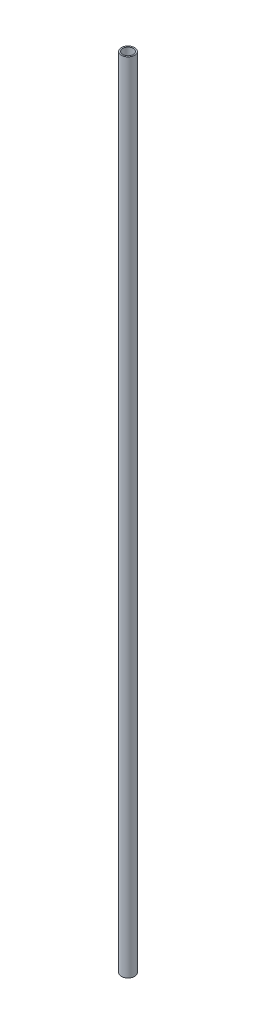
ISO-10303-21;
HEADER;
FILE_DESCRIPTION(('STEP AP214'),'2;1');
FILE_NAME('part.step','',(''),(''),'','','');
FILE_SCHEMA(('AUTOMOTIVE_DESIGN { 1 0 10303 214 1 1 1 1 }'));
ENDSEC;
DATA;
#1=APPLICATION_CONTEXT('core data for automotive mechanical design processes');
#2=APPLICATION_PROTOCOL_DEFINITION('international standard','automotive_design',2000,#1);
#3=PRODUCT_CONTEXT('',#1,'mechanical');
#4=PRODUCT('Part','Part','',(#3));
#5=PRODUCT_RELATED_PRODUCT_CATEGORY('part','',(#4));
#6=PRODUCT_DEFINITION_FORMATION('','',#4);
#7=PRODUCT_DEFINITION_CONTEXT('part definition',#1,'design');
#8=PRODUCT_DEFINITION('design','',#6,#7);
#9=PRODUCT_DEFINITION_SHAPE('','',#8);
#10=(LENGTH_UNIT() NAMED_UNIT(*) SI_UNIT(.MILLI.,.METRE.));
#11=(NAMED_UNIT(*) PLANE_ANGLE_UNIT() SI_UNIT($,.RADIAN.));
#12=(NAMED_UNIT(*) SI_UNIT($,.STERADIAN.) SOLID_ANGLE_UNIT());
#13=UNCERTAINTY_MEASURE_WITH_UNIT(LENGTH_MEASURE(1.E-05),#10,'distance_accuracy_value','');
#14=(GEOMETRIC_REPRESENTATION_CONTEXT(3) GLOBAL_UNCERTAINTY_ASSIGNED_CONTEXT((#13)) GLOBAL_UNIT_ASSIGNED_CONTEXT((#10,
#11,#12)) REPRESENTATION_CONTEXT('',''));
#15=CARTESIAN_POINT('',(0.,0.,0.));
#16=DIRECTION('',(0.,0.,1.));
#17=DIRECTION('',(1.,0.,0.));
#18=AXIS2_PLACEMENT_3D('',#15,#16,#17);
#19=CARTESIAN_POINT('',(0.,600.,0.));
#20=DIRECTION('',(0.,1.,0.));
#21=DIRECTION('',(0.,0.,1.));
#22=AXIS2_PLACEMENT_3D('',#19,#20,#21);
#23=PLANE('',#22);
#24=CARTESIAN_POINT('',(0.,600.,0.));
#25=DIRECTION('',(0.,1.,0.));
#26=DIRECTION('',(0.,0.,1.));
#27=AXIS2_PLACEMENT_3D('',#24,#25,#26);
#28=CIRCLE('',#27,5.);
#29=CARTESIAN_POINT('',(0.,600.,5.));
#30=VERTEX_POINT('',#29);
#31=EDGE_CURVE('E10',#30,#30,#28,.T.);
#32=ORIENTED_EDGE('',*,*,#31,.T.);
#33=EDGE_LOOP('',(#32));
#34=FACE_BOUND('',#33,.T.);
#35=CARTESIAN_POINT('',(0.,600.,0.));
#36=DIRECTION('',(0.,1.,0.));
#37=DIRECTION('',(0.,0.,1.));
#38=AXIS2_PLACEMENT_3D('',#35,#36,#37);
#39=CIRCLE('',#38,4.);
#40=CARTESIAN_POINT('',(0.,600.,4.));
#41=VERTEX_POINT('',#40);
#42=EDGE_CURVE('E46',#41,#41,#39,.T.);
#43=ORIENTED_EDGE('',*,*,#42,.F.);
#44=EDGE_LOOP('',(#43));
#45=FACE_BOUND('',#44,.T.);
#46=ADVANCED_FACE('F35',(#34,#45),#23,.T.);
#47=CARTESIAN_POINT('',(0.,0.,0.));
#48=DIRECTION('',(0.,1.,0.));
#49=DIRECTION('',(0.,0.,1.));
#50=AXIS2_PLACEMENT_3D('',#47,#48,#49);
#51=PLANE('',#50);
#52=CARTESIAN_POINT('',(0.,0.,0.));
#53=DIRECTION('',(0.,1.,0.));
#54=DIRECTION('',(0.,0.,1.));
#55=AXIS2_PLACEMENT_3D('',#52,#53,#54);
#56=CIRCLE('',#55,5.);
#57=CARTESIAN_POINT('',(0.,0.,5.));
#58=VERTEX_POINT('',#57);
#59=EDGE_CURVE('E39',#58,#58,#56,.T.);
#60=ORIENTED_EDGE('',*,*,#59,.F.);
#61=EDGE_LOOP('',(#60));
#62=FACE_BOUND('',#61,.T.);
#63=CARTESIAN_POINT('',(0.,0.,0.));
#64=DIRECTION('',(0.,1.,0.));
#65=DIRECTION('',(0.,0.,1.));
#66=AXIS2_PLACEMENT_3D('',#63,#64,#65);
#67=CIRCLE('',#66,4.);
#68=CARTESIAN_POINT('',(0.,0.,4.));
#69=VERTEX_POINT('',#68);
#70=EDGE_CURVE('E48',#69,#69,#67,.T.);
#71=ORIENTED_EDGE('',*,*,#70,.T.);
#72=EDGE_LOOP('',(#71));
#73=FACE_BOUND('',#72,.T.);
#74=ADVANCED_FACE('F58',(#62,#73),#51,.F.);
#75=CARTESIAN_POINT('',(0.,600.,0.));
#76=DIRECTION('',(0.,-1.,0.));
#77=DIRECTION('',(0.,0.,-1.));
#78=AXIS2_PLACEMENT_3D('',#75,#76,#77);
#79=CYLINDRICAL_SURFACE('',#78,5.);
#80=ORIENTED_EDGE('',*,*,#31,.F.);
#81=EDGE_LOOP('',(#80));
#82=FACE_BOUND('',#81,.T.);
#83=ORIENTED_EDGE('',*,*,#59,.T.);
#84=EDGE_LOOP('',(#83));
#85=FACE_BOUND('',#84,.T.);
#86=ADVANCED_FACE('F37',(#82,#85),#79,.T.);
#87=CARTESIAN_POINT('',(0.,600.,0.));
#88=DIRECTION('',(0.,-1.,0.));
#89=DIRECTION('',(0.,0.,-1.));
#90=AXIS2_PLACEMENT_3D('',#87,#88,#89);
#91=CYLINDRICAL_SURFACE('',#90,4.);
#92=ORIENTED_EDGE('',*,*,#42,.T.);
#93=EDGE_LOOP('',(#92));
#94=FACE_BOUND('',#93,.T.);
#95=ORIENTED_EDGE('',*,*,#70,.F.);
#96=EDGE_LOOP('',(#95));
#97=FACE_BOUND('',#96,.T.);
#98=ADVANCED_FACE('F54',(#94,#97),#91,.F.);
#99=CLOSED_SHELL('',(#46,#74,#86,#98));
#100=MANIFOLD_SOLID_BREP('B2',#99);
#101=ADVANCED_BREP_SHAPE_REPRESENTATION('',(#18,#100),#14);
#102=SHAPE_DEFINITION_REPRESENTATION(#9,#101);
ENDSEC;
END-ISO-10303-21;
